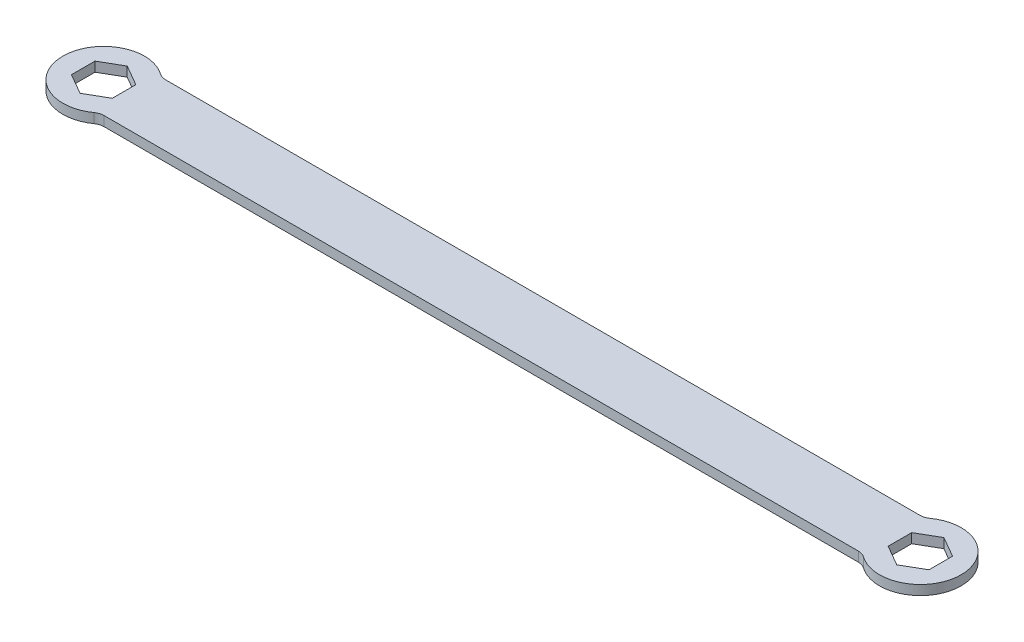
ISO-10303-21;
HEADER;
FILE_DESCRIPTION(('STEP AP214'),'2;1');
FILE_NAME('part.step','',(''),(''),'','','');
FILE_SCHEMA(('AUTOMOTIVE_DESIGN { 1 0 10303 214 1 1 1 1 }'));
ENDSEC;
DATA;
#1=APPLICATION_CONTEXT('core data for automotive mechanical design processes');
#2=APPLICATION_PROTOCOL_DEFINITION('international standard','automotive_design',2000,#1);
#3=PRODUCT_CONTEXT('',#1,'mechanical');
#4=PRODUCT('Part','Part','',(#3));
#5=PRODUCT_RELATED_PRODUCT_CATEGORY('part','',(#4));
#6=PRODUCT_DEFINITION_FORMATION('','',#4);
#7=PRODUCT_DEFINITION_CONTEXT('part definition',#1,'design');
#8=PRODUCT_DEFINITION('design','',#6,#7);
#9=PRODUCT_DEFINITION_SHAPE('','',#8);
#10=(LENGTH_UNIT() NAMED_UNIT(*) SI_UNIT(.MILLI.,.METRE.));
#11=(NAMED_UNIT(*) PLANE_ANGLE_UNIT() SI_UNIT($,.RADIAN.));
#12=(NAMED_UNIT(*) SI_UNIT($,.STERADIAN.) SOLID_ANGLE_UNIT());
#13=UNCERTAINTY_MEASURE_WITH_UNIT(LENGTH_MEASURE(1.E-05),#10,'distance_accuracy_value','');
#14=(GEOMETRIC_REPRESENTATION_CONTEXT(3) GLOBAL_UNCERTAINTY_ASSIGNED_CONTEXT((#13)) GLOBAL_UNIT_ASSIGNED_CONTEXT((#10,
#11,#12)) REPRESENTATION_CONTEXT('',''));
#15=CARTESIAN_POINT('',(0.,0.,0.));
#16=DIRECTION('',(0.,0.,1.));
#17=DIRECTION('',(1.,0.,0.));
#18=AXIS2_PLACEMENT_3D('',#15,#16,#17);
#19=CARTESIAN_POINT('',(-60.3322226305552,0.75,0.));
#20=DIRECTION('',(-1.,0.,0.));
#21=DIRECTION('',(0.,0.,1.));
#22=AXIS2_PLACEMENT_3D('',#19,#20,#21);
#23=PLANE('',#22);
#24=DIRECTION('',(0.,0.,-1.));
#25=VECTOR('',#24,1.);
#26=CARTESIAN_POINT('',(-60.3322226305552,-0.75,0.));
#27=LINE('',#26,#25);
#28=CARTESIAN_POINT('',(-60.3322226305552,-0.75,1.83308710467706));
#29=VERTEX_POINT('',#28);
#30=CARTESIAN_POINT('',(-60.3322226305552,-0.75,-1.83308710467706));
#31=VERTEX_POINT('',#30);
#32=EDGE_CURVE('E256',#29,#31,#27,.T.);
#33=ORIENTED_EDGE('',*,*,#32,.F.);
#34=DIRECTION('',(0.,-1.,0.));
#35=VECTOR('',#34,1.);
#36=CARTESIAN_POINT('',(-60.3322226305552,0.75,1.83308710467706));
#37=LINE('',#36,#35);
#38=CARTESIAN_POINT('',(-60.3322226305552,0.75,1.83308710467706));
#39=VERTEX_POINT('',#38);
#40=EDGE_CURVE('E284',#39,#29,#37,.T.);
#41=ORIENTED_EDGE('',*,*,#40,.F.);
#42=DIRECTION('',(0.,0.,-1.));
#43=VECTOR('',#42,1.);
#44=CARTESIAN_POINT('',(-60.3322226305552,0.75,0.));
#45=LINE('',#44,#43);
#46=CARTESIAN_POINT('',(-60.3322226305552,0.75,-1.83308710467706));
#47=VERTEX_POINT('',#46);
#48=EDGE_CURVE('E210',#39,#47,#45,.T.);
#49=ORIENTED_EDGE('',*,*,#48,.T.);
#50=DIRECTION('',(0.,-1.,0.));
#51=VECTOR('',#50,1.);
#52=CARTESIAN_POINT('',(-60.3322226305552,0.75,-1.83308710467706));
#53=LINE('',#52,#51);
#54=EDGE_CURVE('E182',#47,#31,#53,.T.);
#55=ORIENTED_EDGE('',*,*,#54,.T.);
#56=EDGE_LOOP('',(#33,#41,#49,#55));
#57=FACE_BOUND('',#56,.T.);
#58=ADVANCED_FACE('F34',(#57),#23,.T.);
#59=CARTESIAN_POINT('',(-14.2893056576388,0.75,-24.7498034039118));
#60=DIRECTION('',(-0.5,0.,-0.866025403784438));
#61=DIRECTION('',(-0.866025403784439,0.,0.5));
#62=AXIS2_PLACEMENT_3D('',#59,#60,#61);
#63=PLANE('',#62);
#64=DIRECTION('',(0.866025403784439,0.,-0.5));
#65=VECTOR('',#64,1.);
#66=CARTESIAN_POINT('',(-14.2893056576388,-0.75,-24.7498034039118));
#67=LINE('',#66,#65);
#68=CARTESIAN_POINT('',(-63.5072226305552,-0.75,3.66617420935412));
#69=VERTEX_POINT('',#68);
#70=EDGE_CURVE('E259',#69,#29,#67,.T.);
#71=ORIENTED_EDGE('',*,*,#70,.F.);
#72=DIRECTION('',(0.,-1.,0.));
#73=VECTOR('',#72,1.);
#74=CARTESIAN_POINT('',(-63.5072226305552,0.75,3.66617420935412));
#75=LINE('',#74,#73);
#76=CARTESIAN_POINT('',(-63.5072226305552,0.75,3.66617420935412));
#77=VERTEX_POINT('',#76);
#78=EDGE_CURVE('E282',#77,#69,#75,.T.);
#79=ORIENTED_EDGE('',*,*,#78,.F.);
#80=DIRECTION('',(0.866025403784439,0.,-0.5));
#81=VECTOR('',#80,1.);
#82=CARTESIAN_POINT('',(-14.2893056576388,0.75,-24.7498034039118));
#83=LINE('',#82,#81);
#84=EDGE_CURVE('E213',#77,#39,#83,.T.);
#85=ORIENTED_EDGE('',*,*,#84,.T.);
#86=ORIENTED_EDGE('',*,*,#40,.T.);
#87=EDGE_LOOP('',(#71,#79,#85,#86));
#88=FACE_BOUND('',#87,.T.);
#89=ADVANCED_FACE('F371',(#88),#63,.T.);
#90=CARTESIAN_POINT('',(-17.4643056576388,0.75,30.249064717943));
#91=DIRECTION('',(0.500000000000001,0.,-0.866025403784438));
#92=DIRECTION('',(-0.866025403784438,0.,-0.500000000000001));
#93=AXIS2_PLACEMENT_3D('',#90,#91,#92);
#94=PLANE('',#93);
#95=DIRECTION('',(0.866025403784438,0.,0.500000000000001));
#96=VECTOR('',#95,1.);
#97=CARTESIAN_POINT('',(-17.4643056576388,-0.75,30.249064717943));
#98=LINE('',#97,#96);
#99=CARTESIAN_POINT('',(-66.6822226305552,-0.75,1.83308710467705));
#100=VERTEX_POINT('',#99);
#101=EDGE_CURVE('E262',#100,#69,#98,.T.);
#102=ORIENTED_EDGE('',*,*,#101,.F.);
#103=DIRECTION('',(0.,-1.,0.));
#104=VECTOR('',#103,1.);
#105=CARTESIAN_POINT('',(-66.6822226305552,0.75,1.83308710467705));
#106=LINE('',#105,#104);
#107=CARTESIAN_POINT('',(-66.6822226305552,0.75,1.83308710467705));
#108=VERTEX_POINT('',#107);
#109=EDGE_CURVE('E280',#108,#100,#106,.T.);
#110=ORIENTED_EDGE('',*,*,#109,.F.);
#111=DIRECTION('',(0.866025403784438,0.,0.500000000000001));
#112=VECTOR('',#111,1.);
#113=CARTESIAN_POINT('',(-17.4643056576388,0.75,30.249064717943));
#114=LINE('',#113,#112);
#115=EDGE_CURVE('E216',#108,#77,#114,.T.);
#116=ORIENTED_EDGE('',*,*,#115,.T.);
#117=ORIENTED_EDGE('',*,*,#78,.T.);
#118=EDGE_LOOP('',(#102,#110,#116,#117));
#119=FACE_BOUND('',#118,.T.);
#120=ADVANCED_FACE('F377',(#119),#94,.T.);
#121=CARTESIAN_POINT('',(-66.6822226305552,0.75,0.));
#122=DIRECTION('',(1.,0.,0.));
#123=DIRECTION('',(0.,0.,-1.));
#124=AXIS2_PLACEMENT_3D('',#121,#122,#123);
#125=PLANE('',#124);
#126=DIRECTION('',(0.,0.,1.));
#127=VECTOR('',#126,1.);
#128=CARTESIAN_POINT('',(-66.6822226305552,-0.75,0.));
#129=LINE('',#128,#127);
#130=CARTESIAN_POINT('',(-66.6822226305552,-0.75,-1.83308710467706));
#131=VERTEX_POINT('',#130);
#132=EDGE_CURVE('E265',#131,#100,#129,.T.);
#133=ORIENTED_EDGE('',*,*,#132,.F.);
#134=DIRECTION('',(0.,-1.,0.));
#135=VECTOR('',#134,1.);
#136=CARTESIAN_POINT('',(-66.6822226305552,0.75,-1.83308710467706));
#137=LINE('',#136,#135);
#138=CARTESIAN_POINT('',(-66.6822226305552,0.75,-1.83308710467706));
#139=VERTEX_POINT('',#138);
#140=EDGE_CURVE('E278',#139,#131,#137,.T.);
#141=ORIENTED_EDGE('',*,*,#140,.F.);
#142=DIRECTION('',(0.,0.,1.));
#143=VECTOR('',#142,1.);
#144=CARTESIAN_POINT('',(-66.6822226305552,0.75,0.));
#145=LINE('',#144,#143);
#146=EDGE_CURVE('E219',#139,#108,#145,.T.);
#147=ORIENTED_EDGE('',*,*,#146,.T.);
#148=ORIENTED_EDGE('',*,*,#109,.T.);
#149=EDGE_LOOP('',(#133,#141,#147,#148));
#150=FACE_BOUND('',#149,.T.);
#151=ADVANCED_FACE('F428',(#150),#125,.T.);
#152=CARTESIAN_POINT('',(-17.4643056576388,0.75,-30.249064717943));
#153=DIRECTION('',(0.500000000000001,0.,0.866025403784438));
#154=DIRECTION('',(0.866025403784438,0.,-0.500000000000001));
#155=AXIS2_PLACEMENT_3D('',#152,#153,#154);
#156=PLANE('',#155);
#157=DIRECTION('',(-0.866025403784438,0.,0.5));
#158=VECTOR('',#157,1.);
#159=CARTESIAN_POINT('',(-17.4643056576388,-0.75,-30.249064717943));
#160=LINE('',#159,#158);
#161=CARTESIAN_POINT('',(-63.5072226305552,-0.75,-3.66617420935413));
#162=VERTEX_POINT('',#161);
#163=EDGE_CURVE('E268',#162,#131,#160,.T.);
#164=ORIENTED_EDGE('',*,*,#163,.F.);
#165=DIRECTION('',(0.,-1.,0.));
#166=VECTOR('',#165,1.);
#167=CARTESIAN_POINT('',(-63.5072226305552,0.75,-3.66617420935413));
#168=LINE('',#167,#166);
#169=CARTESIAN_POINT('',(-63.5072226305552,0.75,-3.66617420935413));
#170=VERTEX_POINT('',#169);
#171=EDGE_CURVE('E276',#170,#162,#168,.T.);
#172=ORIENTED_EDGE('',*,*,#171,.F.);
#173=DIRECTION('',(-0.866025403784438,0.,0.5));
#174=VECTOR('',#173,1.);
#175=CARTESIAN_POINT('',(-17.4643056576388,0.75,-30.249064717943));
#176=LINE('',#175,#174);
#177=EDGE_CURVE('E222',#170,#139,#176,.T.);
#178=ORIENTED_EDGE('',*,*,#177,.T.);
#179=ORIENTED_EDGE('',*,*,#140,.T.);
#180=EDGE_LOOP('',(#164,#172,#178,#179));
#181=FACE_BOUND('',#180,.T.);
#182=ADVANCED_FACE('F403',(#181),#156,.T.);
#183=CARTESIAN_POINT('',(14.2893056576388,0.75,-24.7498034039118));
#184=DIRECTION('',(0.5,0.,-0.866025403784439));
#185=DIRECTION('',(-0.866025403784439,0.,-0.5));
#186=AXIS2_PLACEMENT_3D('',#183,#184,#185);
#187=PLANE('',#186);
#188=DIRECTION('',(0.866025403784439,0.,0.5));
#189=VECTOR('',#188,1.);
#190=CARTESIAN_POINT('',(14.2893056576388,-0.75,-24.7498034039118));
#191=LINE('',#190,#189);
#192=CARTESIAN_POINT('',(60.3322226305552,-0.75,1.83308710467706));
#193=VERTEX_POINT('',#192);
#194=CARTESIAN_POINT('',(63.5072226305552,-0.75,3.66617420935414));
#195=VERTEX_POINT('',#194);
#196=EDGE_CURVE('E177',#193,#195,#191,.T.);
#197=ORIENTED_EDGE('',*,*,#196,.F.);
#198=DIRECTION('',(0.,-1.,0.));
#199=VECTOR('',#198,1.);
#200=CARTESIAN_POINT('',(60.3322226305552,0.75,1.83308710467706));
#201=LINE('',#200,#199);
#202=CARTESIAN_POINT('',(60.3322226305552,0.75,1.83308710467706));
#203=VERTEX_POINT('',#202);
#204=EDGE_CURVE('E171',#203,#193,#201,.T.);
#205=ORIENTED_EDGE('',*,*,#204,.F.);
#206=DIRECTION('',(0.866025403784439,0.,0.5));
#207=VECTOR('',#206,1.);
#208=CARTESIAN_POINT('',(14.2893056576388,0.75,-24.7498034039118));
#209=LINE('',#208,#207);
#210=CARTESIAN_POINT('',(63.5072226305552,0.75,3.66617420935414));
#211=VERTEX_POINT('',#210);
#212=EDGE_CURVE('E174',#203,#211,#209,.T.);
#213=ORIENTED_EDGE('',*,*,#212,.T.);
#214=DIRECTION('',(0.,-1.,0.));
#215=VECTOR('',#214,1.);
#216=CARTESIAN_POINT('',(63.5072226305552,0.75,3.66617420935414));
#217=LINE('',#216,#215);
#218=EDGE_CURVE('E228',#211,#195,#217,.T.);
#219=ORIENTED_EDGE('',*,*,#218,.T.);
#220=EDGE_LOOP('',(#197,#205,#213,#219));
#221=FACE_BOUND('',#220,.T.);
#222=ADVANCED_FACE('F173',(#221),#187,.T.);
#223=CARTESIAN_POINT('',(60.3322226305552,0.75,0.));
#224=DIRECTION('',(1.,0.,0.));
#225=DIRECTION('',(0.,0.,-1.));
#226=AXIS2_PLACEMENT_3D('',#223,#224,#225);
#227=PLANE('',#226);
#228=DIRECTION('',(0.,0.,1.));
#229=VECTOR('',#228,1.);
#230=CARTESIAN_POINT('',(60.3322226305552,-0.75,0.));
#231=LINE('',#230,#229);
#232=CARTESIAN_POINT('',(60.3322226305552,-0.75,-1.83308710467705));
#233=VERTEX_POINT('',#232);
#234=EDGE_CURVE('E242',#233,#193,#231,.T.);
#235=ORIENTED_EDGE('',*,*,#234,.F.);
#236=DIRECTION('',(0.,-1.,0.));
#237=VECTOR('',#236,1.);
#238=CARTESIAN_POINT('',(60.3322226305552,0.75,-1.83308710467705));
#239=LINE('',#238,#237);
#240=CARTESIAN_POINT('',(60.3322226305552,0.75,-1.83308710467705));
#241=VERTEX_POINT('',#240);
#242=EDGE_CURVE('E183',#241,#233,#239,.T.);
#243=ORIENTED_EDGE('',*,*,#242,.F.);
#244=DIRECTION('',(0.,0.,1.));
#245=VECTOR('',#244,1.);
#246=CARTESIAN_POINT('',(60.3322226305552,0.75,0.));
#247=LINE('',#246,#245);
#248=EDGE_CURVE('E190',#241,#203,#247,.T.);
#249=ORIENTED_EDGE('',*,*,#248,.T.);
#250=ORIENTED_EDGE('',*,*,#204,.T.);
#251=EDGE_LOOP('',(#235,#243,#249,#250));
#252=FACE_BOUND('',#251,.T.);
#253=ADVANCED_FACE('F197',(#252),#227,.T.);
#254=CARTESIAN_POINT('',(14.2893056576388,0.75,24.7498034039118));
#255=DIRECTION('',(0.500000000000001,0.,0.866025403784438));
#256=DIRECTION('',(0.866025403784438,0.,-0.500000000000001));
#257=AXIS2_PLACEMENT_3D('',#254,#255,#256);
#258=PLANE('',#257);
#259=DIRECTION('',(-0.866025403784438,0.,0.500000000000001));
#260=VECTOR('',#259,1.);
#261=CARTESIAN_POINT('',(14.2893056576388,-0.75,24.7498034039118));
#262=LINE('',#261,#260);
#263=CARTESIAN_POINT('',(63.5072226305552,-0.75,-3.6661742093541));
#264=VERTEX_POINT('',#263);
#265=EDGE_CURVE('E244',#264,#233,#262,.T.);
#266=ORIENTED_EDGE('',*,*,#265,.F.);
#267=DIRECTION('',(0.,-1.,0.));
#268=VECTOR('',#267,1.);
#269=CARTESIAN_POINT('',(63.5072226305552,0.75,-3.6661742093541));
#270=LINE('',#269,#268);
#271=CARTESIAN_POINT('',(63.5072226305552,0.75,-3.6661742093541));
#272=VERTEX_POINT('',#271);
#273=EDGE_CURVE('E292',#272,#264,#270,.T.);
#274=ORIENTED_EDGE('',*,*,#273,.F.);
#275=DIRECTION('',(-0.866025403784438,0.,0.500000000000001));
#276=VECTOR('',#275,1.);
#277=CARTESIAN_POINT('',(14.2893056576388,0.75,24.7498034039118));
#278=LINE('',#277,#276);
#279=EDGE_CURVE('E198',#272,#241,#278,.T.);
#280=ORIENTED_EDGE('',*,*,#279,.T.);
#281=ORIENTED_EDGE('',*,*,#242,.T.);
#282=EDGE_LOOP('',(#266,#274,#280,#281));
#283=FACE_BOUND('',#282,.T.);
#284=ADVANCED_FACE('F394',(#283),#258,.T.);
#285=CARTESIAN_POINT('',(17.4643056576387,0.75,-30.2490647179429));
#286=DIRECTION('',(-0.499999999999999,0.,0.866025403784439));
#287=DIRECTION('',(0.866025403784439,0.,0.499999999999999));
#288=AXIS2_PLACEMENT_3D('',#285,#286,#287);
#289=PLANE('',#288);
#290=DIRECTION('',(-0.866025403784439,0.,-0.499999999999999));
#291=VECTOR('',#290,1.);
#292=CARTESIAN_POINT('',(17.4643056576387,-0.75,-30.2490647179429));
#293=LINE('',#292,#291);
#294=CARTESIAN_POINT('',(66.6822226305552,-0.75,-1.83308710467705));
#295=VERTEX_POINT('',#294);
#296=EDGE_CURVE('E247',#295,#264,#293,.T.);
#297=ORIENTED_EDGE('',*,*,#296,.F.);
#298=DIRECTION('',(0.,-1.,0.));
#299=VECTOR('',#298,1.);
#300=CARTESIAN_POINT('',(66.6822226305552,0.75,-1.83308710467705));
#301=LINE('',#300,#299);
#302=CARTESIAN_POINT('',(66.6822226305552,0.75,-1.83308710467705));
#303=VERTEX_POINT('',#302);
#304=EDGE_CURVE('E290',#303,#295,#301,.T.);
#305=ORIENTED_EDGE('',*,*,#304,.F.);
#306=DIRECTION('',(-0.866025403784439,0.,-0.499999999999999));
#307=VECTOR('',#306,1.);
#308=CARTESIAN_POINT('',(17.4643056576387,0.75,-30.2490647179429));
#309=LINE('',#308,#307);
#310=EDGE_CURVE('E200',#303,#272,#309,.T.);
#311=ORIENTED_EDGE('',*,*,#310,.T.);
#312=ORIENTED_EDGE('',*,*,#273,.T.);
#313=EDGE_LOOP('',(#297,#305,#311,#312));
#314=FACE_BOUND('',#313,.T.);
#315=ADVANCED_FACE('F390',(#314),#289,.T.);
#316=CARTESIAN_POINT('',(66.6822226305552,0.75,0.));
#317=DIRECTION('',(-1.,0.,0.));
#318=DIRECTION('',(0.,0.,1.));
#319=AXIS2_PLACEMENT_3D('',#316,#317,#318);
#320=PLANE('',#319);
#321=DIRECTION('',(0.,0.,-1.));
#322=VECTOR('',#321,1.);
#323=CARTESIAN_POINT('',(66.6822226305552,-0.75,0.));
#324=LINE('',#323,#322);
#325=CARTESIAN_POINT('',(66.6822226305552,-0.75,1.83308710467707));
#326=VERTEX_POINT('',#325);
#327=EDGE_CURVE('E250',#326,#295,#324,.T.);
#328=ORIENTED_EDGE('',*,*,#327,.F.);
#329=DIRECTION('',(0.,-1.,0.));
#330=VECTOR('',#329,1.);
#331=CARTESIAN_POINT('',(66.6822226305552,0.75,1.83308710467707));
#332=LINE('',#331,#330);
#333=CARTESIAN_POINT('',(66.6822226305552,0.75,1.83308710467707));
#334=VERTEX_POINT('',#333);
#335=EDGE_CURVE('E288',#334,#326,#332,.T.);
#336=ORIENTED_EDGE('',*,*,#335,.F.);
#337=DIRECTION('',(0.,0.,-1.));
#338=VECTOR('',#337,1.);
#339=CARTESIAN_POINT('',(66.6822226305552,0.75,0.));
#340=LINE('',#339,#338);
#341=EDGE_CURVE('E206',#334,#303,#340,.T.);
#342=ORIENTED_EDGE('',*,*,#341,.T.);
#343=ORIENTED_EDGE('',*,*,#304,.T.);
#344=EDGE_LOOP('',(#328,#336,#342,#343));
#345=FACE_BOUND('',#344,.T.);
#346=ADVANCED_FACE('F387',(#345),#320,.T.);
#347=CARTESIAN_POINT('',(63.5072226305552,0.75,0.));
#348=DIRECTION('',(0.,-1.,0.));
#349=DIRECTION('',(0.,0.,-1.));
#350=AXIS2_PLACEMENT_3D('',#347,#348,#349);
#351=CYLINDRICAL_SURFACE('',#350,6.35);
#352=CARTESIAN_POINT('',(63.5072226305552,-0.75,0.));
#353=DIRECTION('',(0.,1.,0.));
#354=DIRECTION('',(0.,0.,1.));
#355=AXIS2_PLACEMENT_3D('',#352,#353,#354);
#356=CIRCLE('',#355,6.35);
#357=CARTESIAN_POINT('',(59.8220366076356,-0.75,-5.17125748502994));
#358=VERTEX_POINT('',#357);
#359=CARTESIAN_POINT('',(59.8220366076356,-0.75,5.17125748502994));
#360=VERTEX_POINT('',#359);
#361=EDGE_CURVE('E229',#358,#360,#356,.F.);
#362=ORIENTED_EDGE('',*,*,#361,.F.);
#363=DIRECTION('',(0.,-1.,0.));
#364=VECTOR('',#363,1.);
#365=CARTESIAN_POINT('',(59.8220366076356,0.75,-5.17125748502994));
#366=LINE('',#365,#364);
#367=CARTESIAN_POINT('',(59.8220366076356,0.75,-5.17125748502994));
#368=VERTEX_POINT('',#367);
#369=EDGE_CURVE('E54',#358,#368,#366,.F.);
#370=ORIENTED_EDGE('',*,*,#369,.T.);
#371=CARTESIAN_POINT('',(63.5072226305552,0.75,0.));
#372=DIRECTION('',(0.,1.,0.));
#373=DIRECTION('',(0.,0.,1.));
#374=AXIS2_PLACEMENT_3D('',#371,#372,#373);
#375=CIRCLE('',#374,6.35);
#376=CARTESIAN_POINT('',(59.8220366076356,0.75,5.17125748502994));
#377=VERTEX_POINT('',#376);
#378=EDGE_CURVE('E274',#368,#377,#375,.F.);
#379=ORIENTED_EDGE('',*,*,#378,.T.);
#380=DIRECTION('',(0.,-1.,0.));
#381=VECTOR('',#380,1.);
#382=CARTESIAN_POINT('',(59.8220366076356,0.75,5.17125748502994));
#383=LINE('',#382,#381);
#384=EDGE_CURVE('E309',#377,#360,#383,.T.);
#385=ORIENTED_EDGE('',*,*,#384,.T.);
#386=EDGE_LOOP('',(#362,#370,#379,#385));
#387=FACE_BOUND('',#386,.T.);
#388=ADVANCED_FACE('F335',(#387),#351,.T.);
#389=CARTESIAN_POINT('',(0.,0.75,-4.8));
#390=DIRECTION('',(0.,0.,-1.));
#391=DIRECTION('',(-1.,0.,0.));
#392=AXIS2_PLACEMENT_3D('',#389,#390,#391);
#393=PLANE('',#392);
#394=DIRECTION('',(1.,0.,0.));
#395=VECTOR('',#394,1.);
#396=CARTESIAN_POINT('',(0.,-0.75,-4.8));
#397=LINE('',#396,#395);
#398=CARTESIAN_POINT('',(-58.6613480964798,-0.75,-4.8));
#399=VERTEX_POINT('',#398);
#400=CARTESIAN_POINT('',(58.6613480964798,-0.75,-4.8));
#401=VERTEX_POINT('',#400);
#402=EDGE_CURVE('E232',#399,#401,#397,.T.);
#403=ORIENTED_EDGE('',*,*,#402,.F.);
#404=DIRECTION('',(0.,-1.,0.));
#405=VECTOR('',#404,1.);
#406=CARTESIAN_POINT('',(-58.6613480964798,0.75,-4.8));
#407=LINE('',#406,#405);
#408=CARTESIAN_POINT('',(-58.6613480964798,0.75,-4.8));
#409=VERTEX_POINT('',#408);
#410=EDGE_CURVE('E307',#399,#409,#407,.F.);
#411=ORIENTED_EDGE('',*,*,#410,.T.);
#412=DIRECTION('',(1.,0.,0.));
#413=VECTOR('',#412,1.);
#414=CARTESIAN_POINT('',(0.,0.75,-4.8));
#415=LINE('',#414,#413);
#416=CARTESIAN_POINT('',(58.6613480964798,0.75,-4.8));
#417=VERTEX_POINT('',#416);
#418=EDGE_CURVE('E337',#409,#417,#415,.T.);
#419=ORIENTED_EDGE('',*,*,#418,.T.);
#420=DIRECTION('',(0.,1.,0.));
#421=VECTOR('',#420,1.);
#422=CARTESIAN_POINT('',(58.6613480964798,-0.75,-4.8));
#423=LINE('',#422,#421);
#424=EDGE_CURVE('E304',#417,#401,#423,.F.);
#425=ORIENTED_EDGE('',*,*,#424,.T.);
#426=EDGE_LOOP('',(#403,#411,#419,#425));
#427=FACE_BOUND('',#426,.T.);
#428=ADVANCED_FACE('F359',(#427),#393,.T.);
#429=CARTESIAN_POINT('',(-63.5072226305552,0.75,0.));
#430=DIRECTION('',(0.,-1.,0.));
#431=DIRECTION('',(0.,0.,-1.));
#432=AXIS2_PLACEMENT_3D('',#429,#430,#431);
#433=CYLINDRICAL_SURFACE('',#432,6.35);
#434=CARTESIAN_POINT('',(-63.5072226305552,-0.75,0.));
#435=DIRECTION('',(0.,1.,0.));
#436=DIRECTION('',(0.,0.,1.));
#437=AXIS2_PLACEMENT_3D('',#434,#435,#436);
#438=CIRCLE('',#437,6.35);
#439=CARTESIAN_POINT('',(-59.8220366076356,-0.75,-5.17125748502994));
#440=VERTEX_POINT('',#439);
#441=CARTESIAN_POINT('',(-59.8220366076356,-0.75,5.17125748502994));
#442=VERTEX_POINT('',#441);
#443=EDGE_CURVE('E235',#440,#442,#438,.T.);
#444=ORIENTED_EDGE('',*,*,#443,.T.);
#445=DIRECTION('',(0.,-1.,0.));
#446=VECTOR('',#445,1.);
#447=CARTESIAN_POINT('',(-59.8220366076356,0.75,5.17125748502994));
#448=LINE('',#447,#446);
#449=CARTESIAN_POINT('',(-59.8220366076356,0.75,5.17125748502994));
#450=VERTEX_POINT('',#449);
#451=EDGE_CURVE('E302',#442,#450,#448,.F.);
#452=ORIENTED_EDGE('',*,*,#451,.T.);
#453=CARTESIAN_POINT('',(-63.5072226305552,0.75,0.));
#454=DIRECTION('',(0.,1.,0.));
#455=DIRECTION('',(0.,0.,1.));
#456=AXIS2_PLACEMENT_3D('',#453,#454,#455);
#457=CIRCLE('',#456,6.35);
#458=CARTESIAN_POINT('',(-59.8220366076356,0.75,-5.17125748502994));
#459=VERTEX_POINT('',#458);
#460=EDGE_CURVE('E340',#459,#450,#457,.T.);
#461=ORIENTED_EDGE('',*,*,#460,.F.);
#462=DIRECTION('',(0.,-1.,0.));
#463=VECTOR('',#462,1.);
#464=CARTESIAN_POINT('',(-59.8220366076356,0.75,-5.17125748502994));
#465=LINE('',#464,#463);
#466=EDGE_CURVE('E299',#459,#440,#465,.T.);
#467=ORIENTED_EDGE('',*,*,#466,.T.);
#468=EDGE_LOOP('',(#444,#452,#461,#467));
#469=FACE_BOUND('',#468,.T.);
#470=ADVANCED_FACE('F350',(#469),#433,.T.);
#471=CARTESIAN_POINT('',(17.464305657639,0.75,30.2490647179431));
#472=DIRECTION('',(-0.500000000000004,0.,-0.866025403784436));
#473=DIRECTION('',(-0.866025403784437,0.,0.500000000000004));
#474=AXIS2_PLACEMENT_3D('',#471,#472,#473);
#475=PLANE('',#474);
#476=DIRECTION('',(0.866025403784437,0.,-0.500000000000004));
#477=VECTOR('',#476,1.);
#478=CARTESIAN_POINT('',(17.464305657639,-0.75,30.2490647179431));
#479=LINE('',#478,#477);
#480=EDGE_CURVE('E253',#195,#326,#479,.T.);
#481=ORIENTED_EDGE('',*,*,#480,.F.);
#482=ORIENTED_EDGE('',*,*,#218,.F.);
#483=DIRECTION('',(0.866025403784437,0.,-0.500000000000004));
#484=VECTOR('',#483,1.);
#485=CARTESIAN_POINT('',(17.464305657639,0.75,30.2490647179431));
#486=LINE('',#485,#484);
#487=EDGE_CURVE('E194',#211,#334,#486,.T.);
#488=ORIENTED_EDGE('',*,*,#487,.T.);
#489=ORIENTED_EDGE('',*,*,#335,.T.);
#490=EDGE_LOOP('',(#481,#482,#488,#489));
#491=FACE_BOUND('',#490,.T.);
#492=ADVANCED_FACE('F383',(#491),#475,.T.);
#493=CARTESIAN_POINT('',(0.,0.75,4.8));
#494=DIRECTION('',(0.,0.,-1.));
#495=DIRECTION('',(-1.,0.,0.));
#496=AXIS2_PLACEMENT_3D('',#493,#494,#495);
#497=PLANE('',#496);
#498=DIRECTION('',(1.,0.,0.));
#499=VECTOR('',#498,1.);
#500=CARTESIAN_POINT('',(0.,0.75,4.8));
#501=LINE('',#500,#499);
#502=CARTESIAN_POINT('',(-58.6613480964798,0.75,4.8));
#503=VERTEX_POINT('',#502);
#504=CARTESIAN_POINT('',(58.6613480964798,0.75,4.8));
#505=VERTEX_POINT('',#504);
#506=EDGE_CURVE('E195',#503,#505,#501,.T.);
#507=ORIENTED_EDGE('',*,*,#506,.F.);
#508=DIRECTION('',(0.,1.,0.));
#509=VECTOR('',#508,1.);
#510=CARTESIAN_POINT('',(-58.6613480964798,-0.75,4.8));
#511=LINE('',#510,#509);
#512=CARTESIAN_POINT('',(-58.6613480964798,-0.75,4.8));
#513=VERTEX_POINT('',#512);
#514=EDGE_CURVE('E296',#503,#513,#511,.F.);
#515=ORIENTED_EDGE('',*,*,#514,.T.);
#516=DIRECTION('',(1.,0.,0.));
#517=VECTOR('',#516,1.);
#518=CARTESIAN_POINT('',(0.,-0.75,4.8));
#519=LINE('',#518,#517);
#520=CARTESIAN_POINT('',(58.6613480964798,-0.75,4.8));
#521=VERTEX_POINT('',#520);
#522=EDGE_CURVE('E238',#513,#521,#519,.T.);
#523=ORIENTED_EDGE('',*,*,#522,.T.);
#524=DIRECTION('',(0.,-1.,0.));
#525=VECTOR('',#524,1.);
#526=CARTESIAN_POINT('',(58.6613480964798,0.75,4.8));
#527=LINE('',#526,#525);
#528=EDGE_CURVE('E286',#521,#505,#527,.F.);
#529=ORIENTED_EDGE('',*,*,#528,.T.);
#530=EDGE_LOOP('',(#507,#515,#523,#529));
#531=FACE_BOUND('',#530,.T.);
#532=ADVANCED_FACE('F333',(#531),#497,.F.);
#533=CARTESIAN_POINT('',(-14.2893056576387,0.75,24.7498034039118));
#534=DIRECTION('',(-0.499999999999999,0.,0.866025403784439));
#535=DIRECTION('',(0.866025403784439,0.,0.499999999999999));
#536=AXIS2_PLACEMENT_3D('',#533,#534,#535);
#537=PLANE('',#536);
#538=DIRECTION('',(-0.866025403784439,0.,-0.499999999999999));
#539=VECTOR('',#538,1.);
#540=CARTESIAN_POINT('',(-14.2893056576387,-0.75,24.7498034039118));
#541=LINE('',#540,#539);
#542=EDGE_CURVE('E271',#31,#162,#541,.T.);
#543=ORIENTED_EDGE('',*,*,#542,.F.);
#544=ORIENTED_EDGE('',*,*,#54,.F.);
#545=DIRECTION('',(-0.866025403784439,0.,-0.499999999999999));
#546=VECTOR('',#545,1.);
#547=CARTESIAN_POINT('',(-14.2893056576387,0.75,24.7498034039118));
#548=LINE('',#547,#546);
#549=EDGE_CURVE('E225',#47,#170,#548,.T.);
#550=ORIENTED_EDGE('',*,*,#549,.T.);
#551=ORIENTED_EDGE('',*,*,#171,.T.);
#552=EDGE_LOOP('',(#543,#544,#550,#551));
#553=FACE_BOUND('',#552,.T.);
#554=ADVANCED_FACE('F406',(#553),#537,.T.);
#555=CARTESIAN_POINT('',(0.,0.75,0.));
#556=DIRECTION('',(0.,1.,0.));
#557=DIRECTION('',(0.,0.,1.));
#558=AXIS2_PLACEMENT_3D('',#555,#556,#557);
#559=PLANE('',#558);
#560=ORIENTED_EDGE('',*,*,#378,.F.);
#561=CARTESIAN_POINT('',(58.6613480964798,0.75,-6.8));
#562=DIRECTION('',(0.,1.,0.));
#563=DIRECTION('',(0.,0.,1.));
#564=AXIS2_PLACEMENT_3D('',#561,#562,#563);
#565=CIRCLE('',#564,2.);
#566=EDGE_CURVE('E323',#368,#417,#565,.F.);
#567=ORIENTED_EDGE('',*,*,#566,.T.);
#568=ORIENTED_EDGE('',*,*,#418,.F.);
#569=CARTESIAN_POINT('',(-58.6613480964798,0.75,-6.8));
#570=DIRECTION('',(0.,1.,0.));
#571=DIRECTION('',(0.,0.,1.));
#572=AXIS2_PLACEMENT_3D('',#569,#570,#571);
#573=CIRCLE('',#572,2.);
#574=EDGE_CURVE('E319',#409,#459,#573,.F.);
#575=ORIENTED_EDGE('',*,*,#574,.T.);
#576=ORIENTED_EDGE('',*,*,#460,.T.);
#577=CARTESIAN_POINT('',(-58.6613480964798,0.75,6.8));
#578=DIRECTION('',(0.,1.,0.));
#579=DIRECTION('',(0.,0.,1.));
#580=AXIS2_PLACEMENT_3D('',#577,#578,#579);
#581=CIRCLE('',#580,2.);
#582=EDGE_CURVE('E315',#450,#503,#581,.F.);
#583=ORIENTED_EDGE('',*,*,#582,.T.);
#584=ORIENTED_EDGE('',*,*,#506,.T.);
#585=CARTESIAN_POINT('',(58.6613480964798,0.75,6.8));
#586=DIRECTION('',(0.,1.,0.));
#587=DIRECTION('',(0.,0.,1.));
#588=AXIS2_PLACEMENT_3D('',#585,#586,#587);
#589=CIRCLE('',#588,2.);
#590=EDGE_CURVE('E11',#505,#377,#589,.F.);
#591=ORIENTED_EDGE('',*,*,#590,.T.);
#592=EDGE_LOOP('',(#560,#567,#568,#575,#576,#583,#584,#591));
#593=FACE_BOUND('',#592,.T.);
#594=ORIENTED_EDGE('',*,*,#212,.F.);
#595=ORIENTED_EDGE('',*,*,#248,.F.);
#596=ORIENTED_EDGE('',*,*,#279,.F.);
#597=ORIENTED_EDGE('',*,*,#310,.F.);
#598=ORIENTED_EDGE('',*,*,#341,.F.);
#599=ORIENTED_EDGE('',*,*,#487,.F.);
#600=EDGE_LOOP('',(#594,#595,#596,#597,#598,#599));
#601=FACE_BOUND('',#600,.T.);
#602=ORIENTED_EDGE('',*,*,#48,.F.);
#603=ORIENTED_EDGE('',*,*,#84,.F.);
#604=ORIENTED_EDGE('',*,*,#115,.F.);
#605=ORIENTED_EDGE('',*,*,#146,.F.);
#606=ORIENTED_EDGE('',*,*,#177,.F.);
#607=ORIENTED_EDGE('',*,*,#549,.F.);
#608=EDGE_LOOP('',(#602,#603,#604,#605,#606,#607));
#609=FACE_BOUND('',#608,.T.);
#610=ADVANCED_FACE('F187',(#593,#601,#609),#559,.T.);
#611=CARTESIAN_POINT('',(0.,-0.75,0.));
#612=DIRECTION('',(0.,1.,0.));
#613=DIRECTION('',(0.,0.,1.));
#614=AXIS2_PLACEMENT_3D('',#611,#612,#613);
#615=PLANE('',#614);
#616=ORIENTED_EDGE('',*,*,#402,.T.);
#617=CARTESIAN_POINT('',(58.6613480964798,-0.75,-6.8));
#618=DIRECTION('',(0.,1.,0.));
#619=DIRECTION('',(0.,0.,1.));
#620=AXIS2_PLACEMENT_3D('',#617,#618,#619);
#621=CIRCLE('',#620,2.);
#622=EDGE_CURVE('E321',#401,#358,#621,.T.);
#623=ORIENTED_EDGE('',*,*,#622,.T.);
#624=ORIENTED_EDGE('',*,*,#361,.T.);
#625=CARTESIAN_POINT('',(58.6613480964798,-0.75,6.8));
#626=DIRECTION('',(0.,1.,0.));
#627=DIRECTION('',(0.,0.,1.));
#628=AXIS2_PLACEMENT_3D('',#625,#626,#627);
#629=CIRCLE('',#628,2.);
#630=EDGE_CURVE('E42',#360,#521,#629,.T.);
#631=ORIENTED_EDGE('',*,*,#630,.T.);
#632=ORIENTED_EDGE('',*,*,#522,.F.);
#633=CARTESIAN_POINT('',(-58.6613480964798,-0.75,6.8));
#634=DIRECTION('',(0.,1.,0.));
#635=DIRECTION('',(0.,0.,1.));
#636=AXIS2_PLACEMENT_3D('',#633,#634,#635);
#637=CIRCLE('',#636,2.);
#638=EDGE_CURVE('E313',#513,#442,#637,.T.);
#639=ORIENTED_EDGE('',*,*,#638,.T.);
#640=ORIENTED_EDGE('',*,*,#443,.F.);
#641=CARTESIAN_POINT('',(-58.6613480964798,-0.75,-6.8));
#642=DIRECTION('',(0.,1.,0.));
#643=DIRECTION('',(0.,0.,1.));
#644=AXIS2_PLACEMENT_3D('',#641,#642,#643);
#645=CIRCLE('',#644,2.);
#646=EDGE_CURVE('E317',#440,#399,#645,.T.);
#647=ORIENTED_EDGE('',*,*,#646,.T.);
#648=EDGE_LOOP('',(#616,#623,#624,#631,#632,#639,#640,#647));
#649=FACE_BOUND('',#648,.T.);
#650=ORIENTED_EDGE('',*,*,#196,.T.);
#651=ORIENTED_EDGE('',*,*,#480,.T.);
#652=ORIENTED_EDGE('',*,*,#327,.T.);
#653=ORIENTED_EDGE('',*,*,#296,.T.);
#654=ORIENTED_EDGE('',*,*,#265,.T.);
#655=ORIENTED_EDGE('',*,*,#234,.T.);
#656=EDGE_LOOP('',(#650,#651,#652,#653,#654,#655));
#657=FACE_BOUND('',#656,.T.);
#658=ORIENTED_EDGE('',*,*,#32,.T.);
#659=ORIENTED_EDGE('',*,*,#542,.T.);
#660=ORIENTED_EDGE('',*,*,#163,.T.);
#661=ORIENTED_EDGE('',*,*,#132,.T.);
#662=ORIENTED_EDGE('',*,*,#101,.T.);
#663=ORIENTED_EDGE('',*,*,#70,.T.);
#664=EDGE_LOOP('',(#658,#659,#660,#661,#662,#663));
#665=FACE_BOUND('',#664,.T.);
#666=ADVANCED_FACE('F326',(#649,#657,#665),#615,.F.);
#667=CARTESIAN_POINT('',(-58.6613480964798,0.75,6.8));
#668=DIRECTION('',(0.,-1.,0.));
#669=DIRECTION('',(0.,0.,-1.));
#670=AXIS2_PLACEMENT_3D('',#667,#668,#669);
#671=CYLINDRICAL_SURFACE('',#670,2.);
#672=ORIENTED_EDGE('',*,*,#582,.F.);
#673=ORIENTED_EDGE('',*,*,#451,.F.);
#674=ORIENTED_EDGE('',*,*,#638,.F.);
#675=ORIENTED_EDGE('',*,*,#514,.F.);
#676=EDGE_LOOP('',(#672,#673,#674,#675));
#677=FACE_BOUND('',#676,.T.);
#678=ADVANCED_FACE('F346',(#677),#671,.F.);
#679=CARTESIAN_POINT('',(-58.6613480964798,0.75,-6.8));
#680=DIRECTION('',(0.,-1.,0.));
#681=DIRECTION('',(0.,0.,-1.));
#682=AXIS2_PLACEMENT_3D('',#679,#680,#681);
#683=CYLINDRICAL_SURFACE('',#682,2.);
#684=ORIENTED_EDGE('',*,*,#574,.F.);
#685=ORIENTED_EDGE('',*,*,#410,.F.);
#686=ORIENTED_EDGE('',*,*,#646,.F.);
#687=ORIENTED_EDGE('',*,*,#466,.F.);
#688=EDGE_LOOP('',(#684,#685,#686,#687));
#689=FACE_BOUND('',#688,.T.);
#690=ADVANCED_FACE('F355',(#689),#683,.F.);
#691=CARTESIAN_POINT('',(58.6613480964798,0.75,-6.8));
#692=DIRECTION('',(0.,-1.,0.));
#693=DIRECTION('',(0.,0.,-1.));
#694=AXIS2_PLACEMENT_3D('',#691,#692,#693);
#695=CYLINDRICAL_SURFACE('',#694,2.);
#696=ORIENTED_EDGE('',*,*,#566,.F.);
#697=ORIENTED_EDGE('',*,*,#369,.F.);
#698=ORIENTED_EDGE('',*,*,#622,.F.);
#699=ORIENTED_EDGE('',*,*,#424,.F.);
#700=EDGE_LOOP('',(#696,#697,#698,#699));
#701=FACE_BOUND('',#700,.T.);
#702=ADVANCED_FACE('F363',(#701),#695,.F.);
#703=CARTESIAN_POINT('',(58.6613480964798,0.75,6.8));
#704=DIRECTION('',(0.,-1.,0.));
#705=DIRECTION('',(0.,0.,-1.));
#706=AXIS2_PLACEMENT_3D('',#703,#704,#705);
#707=CYLINDRICAL_SURFACE('',#706,2.);
#708=ORIENTED_EDGE('',*,*,#590,.F.);
#709=ORIENTED_EDGE('',*,*,#528,.F.);
#710=ORIENTED_EDGE('',*,*,#630,.F.);
#711=ORIENTED_EDGE('',*,*,#384,.F.);
#712=EDGE_LOOP('',(#708,#709,#710,#711));
#713=FACE_BOUND('',#712,.T.);
#714=ADVANCED_FACE('F36',(#713),#707,.F.);
#715=CLOSED_SHELL('',(#58,#89,#120,#151,#182,#222,#253,#284,#315,#346,#388,#428,#470,#492,#532,
#554,#610,#666,#678,#690,#702,#714));
#716=MANIFOLD_SOLID_BREP('B2',#715);
#717=ADVANCED_BREP_SHAPE_REPRESENTATION('',(#18,#716),#14);
#718=SHAPE_DEFINITION_REPRESENTATION(#9,#717);
ENDSEC;
END-ISO-10303-21;
